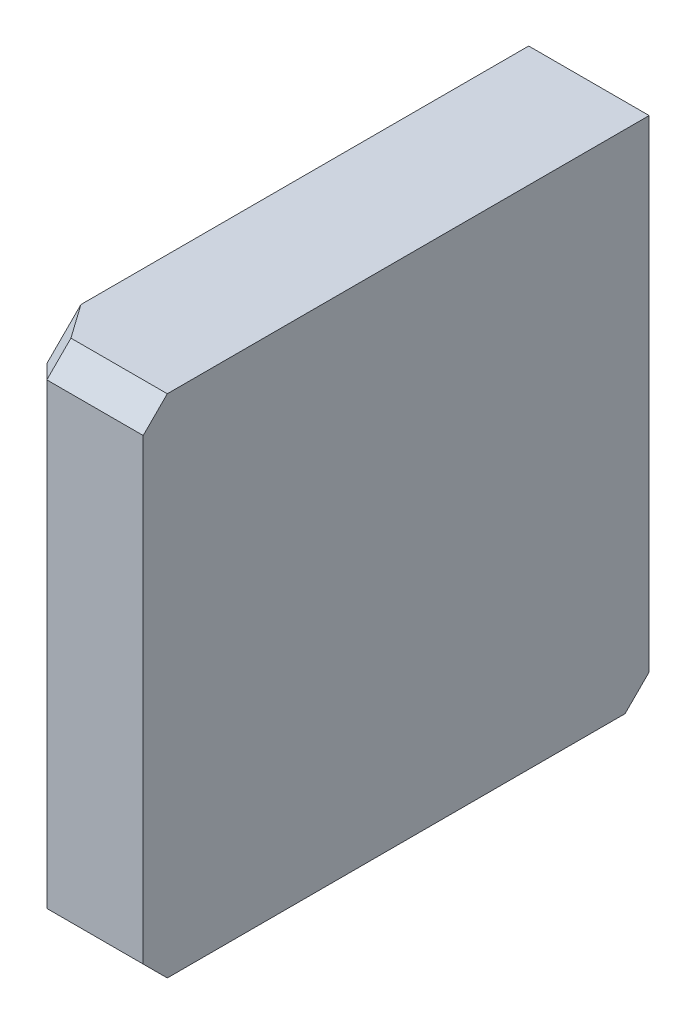
ISO-10303-21;
HEADER;
FILE_DESCRIPTION(('STEP AP214'),'2;1');
FILE_NAME('part.step','',(''),(''),'','','');
FILE_SCHEMA(('AUTOMOTIVE_DESIGN { 1 0 10303 214 1 1 1 1 }'));
ENDSEC;
DATA;
#1=APPLICATION_CONTEXT('core data for automotive mechanical design processes');
#2=APPLICATION_PROTOCOL_DEFINITION('international standard','automotive_design',2000,#1);
#3=PRODUCT_CONTEXT('',#1,'mechanical');
#4=PRODUCT('Part','Part','',(#3));
#5=PRODUCT_RELATED_PRODUCT_CATEGORY('part','',(#4));
#6=PRODUCT_DEFINITION_FORMATION('','',#4);
#7=PRODUCT_DEFINITION_CONTEXT('part definition',#1,'design');
#8=PRODUCT_DEFINITION('design','',#6,#7);
#9=PRODUCT_DEFINITION_SHAPE('','',#8);
#10=(LENGTH_UNIT() NAMED_UNIT(*) SI_UNIT(.MILLI.,.METRE.));
#11=(NAMED_UNIT(*) PLANE_ANGLE_UNIT() SI_UNIT($,.RADIAN.));
#12=(NAMED_UNIT(*) SI_UNIT($,.STERADIAN.) SOLID_ANGLE_UNIT());
#13=UNCERTAINTY_MEASURE_WITH_UNIT(LENGTH_MEASURE(1.E-05),#10,'distance_accuracy_value','');
#14=(GEOMETRIC_REPRESENTATION_CONTEXT(3) GLOBAL_UNCERTAINTY_ASSIGNED_CONTEXT((#13)) GLOBAL_UNIT_ASSIGNED_CONTEXT((#10,
#11,#12)) REPRESENTATION_CONTEXT('',''));
#15=CARTESIAN_POINT('',(0.,0.,0.));
#16=DIRECTION('',(0.,0.,1.));
#17=DIRECTION('',(1.,0.,0.));
#18=AXIS2_PLACEMENT_3D('',#15,#16,#17);
#19=CARTESIAN_POINT('',(-31.1,33.4607864376269,33.460786437627));
#20=DIRECTION('',(0.707106781186548,-0.499999999999999,-0.500000000000001));
#21=DIRECTION('',(-0.577350269189626,0.,-0.816496580927726));
#22=AXIS2_PLACEMENT_3D('',#19,#20,#21);
#23=PLANE('',#22);
#24=DIRECTION('',(0.,0.707106781186549,-0.707106781186546));
#25=VECTOR('',#24,1.);
#26=CARTESIAN_POINT('',(-29.1,21.,48.75));
#27=LINE('',#26,#25);
#28=CARTESIAN_POINT('',(-29.1,19.,50.75));
#29=VERTEX_POINT('',#28);
#30=CARTESIAN_POINT('',(-29.1,21.,48.75));
#31=VERTEX_POINT('',#30);
#32=EDGE_CURVE('E153',#29,#31,#27,.T.);
#33=ORIENTED_EDGE('',*,*,#32,.T.);
#34=DIRECTION('',(-0.577350269189624,0.,-0.816496580927727));
#35=VECTOR('',#34,1.);
#36=CARTESIAN_POINT('',(-29.1,21.,48.75));
#37=LINE('',#36,#35);
#38=CARTESIAN_POINT('',(-31.1,21.,45.9215728752538));
#39=VERTEX_POINT('',#38);
#40=EDGE_CURVE('E188',#31,#39,#37,.T.);
#41=ORIENTED_EDGE('',*,*,#40,.T.);
#42=DIRECTION('',(0.,-0.707106781186548,0.707106781186548));
#43=VECTOR('',#42,1.);
#44=CARTESIAN_POINT('',(-31.1,21.,45.9215728752538));
#45=LINE('',#44,#43);
#46=CARTESIAN_POINT('',(-31.1,18.1715728752538,48.75));
#47=VERTEX_POINT('',#46);
#48=EDGE_CURVE('E134',#39,#47,#45,.T.);
#49=ORIENTED_EDGE('',*,*,#48,.T.);
#50=DIRECTION('',(0.678598344545846,0.281084637714823,0.678598344545846));
#51=VECTOR('',#50,1.);
#52=CARTESIAN_POINT('',(-31.1,18.1715728752538,48.75));
#53=LINE('',#52,#51);
#54=EDGE_CURVE('E19',#47,#29,#53,.T.);
#55=ORIENTED_EDGE('',*,*,#54,.T.);
#56=EDGE_LOOP('',(#33,#41,#49,#55));
#57=FACE_BOUND('',#56,.T.);
#58=ADVANCED_FACE('F16',(#57),#23,.F.);
#59=CARTESIAN_POINT('',(-31.1,29.75,48.75));
#60=DIRECTION('',(0.707106781186548,0.,-0.707106781186548));
#61=DIRECTION('',(-0.707106781186548,0.,-0.707106781186548));
#62=AXIS2_PLACEMENT_3D('',#59,#60,#61);
#63=PLANE('',#62);
#64=DIRECTION('',(0.,1.,0.));
#65=VECTOR('',#64,1.);
#66=CARTESIAN_POINT('',(-29.1,-21.,50.75));
#67=LINE('',#66,#65);
#68=CARTESIAN_POINT('',(-29.1,-19.,50.75));
#69=VERTEX_POINT('',#68);
#70=EDGE_CURVE('E156',#69,#29,#67,.T.);
#71=ORIENTED_EDGE('',*,*,#70,.T.);
#72=ORIENTED_EDGE('',*,*,#54,.F.);
#73=DIRECTION('',(0.,1.,0.));
#74=VECTOR('',#73,1.);
#75=CARTESIAN_POINT('',(-31.1,29.75,48.75));
#76=LINE('',#75,#74);
#77=CARTESIAN_POINT('',(-31.1,-18.1715728752539,48.75));
#78=VERTEX_POINT('',#77);
#79=EDGE_CURVE('E140',#47,#78,#76,.F.);
#80=ORIENTED_EDGE('',*,*,#79,.T.);
#81=DIRECTION('',(0.678598344545846,-0.28108463771481,0.678598344545853));
#82=VECTOR('',#81,1.);
#83=CARTESIAN_POINT('',(-31.1,-18.1715728752538,48.75));
#84=LINE('',#83,#82);
#85=EDGE_CURVE('E106',#78,#69,#84,.T.);
#86=ORIENTED_EDGE('',*,*,#85,.T.);
#87=EDGE_LOOP('',(#71,#72,#80,#86));
#88=FACE_BOUND('',#87,.T.);
#89=ADVANCED_FACE('F157',(#88),#63,.F.);
#90=CARTESIAN_POINT('',(-31.1,-3.71078643762699,63.2107864376269));
#91=DIRECTION('',(0.707106781186547,0.500000000000002,-0.5));
#92=DIRECTION('',(-0.577350269189627,0.816496580927725,0.));
#93=AXIS2_PLACEMENT_3D('',#90,#91,#92);
#94=PLANE('',#93);
#95=DIRECTION('',(0.,0.707106781186546,0.707106781186549));
#96=VECTOR('',#95,1.);
#97=CARTESIAN_POINT('',(-29.1,-19.,50.75));
#98=LINE('',#97,#96);
#99=CARTESIAN_POINT('',(-29.1,-21.,48.75));
#100=VERTEX_POINT('',#99);
#101=EDGE_CURVE('E177',#100,#69,#98,.T.);
#102=ORIENTED_EDGE('',*,*,#101,.T.);
#103=ORIENTED_EDGE('',*,*,#85,.F.);
#104=DIRECTION('',(0.,-0.707106781186527,-0.707106781186568));
#105=VECTOR('',#104,1.);
#106=CARTESIAN_POINT('',(-31.1,-18.1715728752538,48.75));
#107=LINE('',#106,#105);
#108=CARTESIAN_POINT('',(-31.1,-19.,47.9215728752538));
#109=VERTEX_POINT('',#108);
#110=EDGE_CURVE('E109',#78,#109,#107,.T.);
#111=ORIENTED_EDGE('',*,*,#110,.T.);
#112=DIRECTION('',(0.678598344545846,-0.678598344545846,0.281084637714823));
#113=VECTOR('',#112,1.);
#114=CARTESIAN_POINT('',(-31.1,-19.,47.9215728752538));
#115=LINE('',#114,#113);
#116=EDGE_CURVE('E112',#109,#100,#115,.T.);
#117=ORIENTED_EDGE('',*,*,#116,.T.);
#118=EDGE_LOOP('',(#102,#103,#111,#117));
#119=FACE_BOUND('',#118,.T.);
#120=ADVANCED_FACE('F111',(#119),#94,.F.);
#121=CARTESIAN_POINT('',(-31.1,-19.,29.75));
#122=DIRECTION('',(0.707106781186548,0.707106781186548,0.));
#123=DIRECTION('',(-0.707106781186548,0.707106781186548,0.));
#124=AXIS2_PLACEMENT_3D('',#121,#122,#123);
#125=PLANE('',#124);
#126=DIRECTION('',(0.,0.,1.));
#127=VECTOR('',#126,1.);
#128=CARTESIAN_POINT('',(-29.1,-21.,50.75));
#129=LINE('',#128,#127);
#130=CARTESIAN_POINT('',(-29.1,-21.,10.75));
#131=VERTEX_POINT('',#130);
#132=EDGE_CURVE('E124',#131,#100,#129,.T.);
#133=ORIENTED_EDGE('',*,*,#132,.T.);
#134=ORIENTED_EDGE('',*,*,#116,.F.);
#135=DIRECTION('',(0.,0.,-1.));
#136=VECTOR('',#135,1.);
#137=CARTESIAN_POINT('',(-31.1,-19.,29.75));
#138=LINE('',#137,#136);
#139=CARTESIAN_POINT('',(-31.1,-19.,11.5784271247462));
#140=VERTEX_POINT('',#139);
#141=EDGE_CURVE('E118',#109,#140,#138,.T.);
#142=ORIENTED_EDGE('',*,*,#141,.T.);
#143=DIRECTION('',(0.678598344545848,-0.678598344545843,-0.281084637714827));
#144=VECTOR('',#143,1.);
#145=CARTESIAN_POINT('',(-31.1,-19.,11.5784271247462));
#146=LINE('',#145,#144);
#147=EDGE_CURVE('E190',#140,#131,#146,.T.);
#148=ORIENTED_EDGE('',*,*,#147,.T.);
#149=EDGE_LOOP('',(#133,#134,#142,#148));
#150=FACE_BOUND('',#149,.T.);
#151=ADVANCED_FACE('F121',(#150),#125,.F.);
#152=CARTESIAN_POINT('',(-31.1,29.75,29.75));
#153=DIRECTION('',(1.,0.,0.));
#154=DIRECTION('',(0.,0.,-1.));
#155=AXIS2_PLACEMENT_3D('',#152,#153,#154);
#156=PLANE('',#155);
#157=ORIENTED_EDGE('',*,*,#48,.F.);
#158=DIRECTION('',(0.,0.,-1.));
#159=VECTOR('',#158,1.);
#160=CARTESIAN_POINT('',(-31.1,21.,50.75));
#161=LINE('',#160,#159);
#162=CARTESIAN_POINT('',(-31.1,21.,8.75));
#163=VERTEX_POINT('',#162);
#164=EDGE_CURVE('E170',#39,#163,#161,.T.);
#165=ORIENTED_EDGE('',*,*,#164,.T.);
#166=DIRECTION('',(0.,1.,0.));
#167=VECTOR('',#166,1.);
#168=CARTESIAN_POINT('',(-31.1,-21.,8.75));
#169=LINE('',#168,#167);
#170=CARTESIAN_POINT('',(-31.1,-16.1715728752538,8.75));
#171=VERTEX_POINT('',#170);
#172=EDGE_CURVE('E205',#163,#171,#169,.F.);
#173=ORIENTED_EDGE('',*,*,#172,.T.);
#174=DIRECTION('',(0.,-0.70710678118655,0.707106781186544));
#175=VECTOR('',#174,1.);
#176=CARTESIAN_POINT('',(-31.1,-16.1715728752538,8.74999999999999));
#177=LINE('',#176,#175);
#178=EDGE_CURVE('E131',#171,#140,#177,.T.);
#179=ORIENTED_EDGE('',*,*,#178,.T.);
#180=ORIENTED_EDGE('',*,*,#141,.F.);
#181=ORIENTED_EDGE('',*,*,#110,.F.);
#182=ORIENTED_EDGE('',*,*,#79,.F.);
#183=EDGE_LOOP('',(#157,#165,#173,#179,#180,#181,#182));
#184=FACE_BOUND('',#183,.T.);
#185=ADVANCED_FACE('F129',(#184),#156,.F.);
#186=CARTESIAN_POINT('',(-31.1,-3.71078643762681,-3.71078643762692));
#187=DIRECTION('',(0.707106781186548,0.499999999999999,0.500000000000001));
#188=DIRECTION('',(0.577350269189626,0.,-0.816496580927726));
#189=AXIS2_PLACEMENT_3D('',#186,#187,#188);
#190=PLANE('',#189);
#191=DIRECTION('',(0.,-0.707106781186549,0.707106781186546));
#192=VECTOR('',#191,1.);
#193=CARTESIAN_POINT('',(-29.1,-21.,10.75));
#194=LINE('',#193,#192);
#195=CARTESIAN_POINT('',(-29.1,-19.,8.75));
#196=VERTEX_POINT('',#195);
#197=EDGE_CURVE('E220',#196,#131,#194,.T.);
#198=ORIENTED_EDGE('',*,*,#197,.T.);
#199=ORIENTED_EDGE('',*,*,#147,.F.);
#200=ORIENTED_EDGE('',*,*,#178,.F.);
#201=DIRECTION('',(0.577350269189618,-0.816496580927732,0.));
#202=VECTOR('',#201,1.);
#203=CARTESIAN_POINT('',(-31.1,-16.1715728752538,8.75));
#204=LINE('',#203,#202);
#205=EDGE_CURVE('E210',#171,#196,#204,.T.);
#206=ORIENTED_EDGE('',*,*,#205,.T.);
#207=EDGE_LOOP('',(#198,#199,#200,#206));
#208=FACE_BOUND('',#207,.T.);
#209=ADVANCED_FACE('F279',(#208),#190,.F.);
#210=CARTESIAN_POINT('',(-31.1,21.,50.75));
#211=DIRECTION('',(0.,-1.,0.));
#212=DIRECTION('',(0.,0.,-1.));
#213=AXIS2_PLACEMENT_3D('',#210,#211,#212);
#214=PLANE('',#213);
#215=ORIENTED_EDGE('',*,*,#40,.F.);
#216=DIRECTION('',(1.,0.,0.));
#217=VECTOR('',#216,1.);
#218=CARTESIAN_POINT('',(-31.1,21.,48.75));
#219=LINE('',#218,#217);
#220=CARTESIAN_POINT('',(-21.1,21.,48.75));
#221=VERTEX_POINT('',#220);
#222=EDGE_CURVE('E163',#31,#221,#219,.T.);
#223=ORIENTED_EDGE('',*,*,#222,.T.);
#224=DIRECTION('',(0.,0.,-1.));
#225=VECTOR('',#224,1.);
#226=CARTESIAN_POINT('',(-21.1,21.,29.75));
#227=LINE('',#226,#225);
#228=CARTESIAN_POINT('',(-21.1,21.,8.75));
#229=VERTEX_POINT('',#228);
#230=EDGE_CURVE('E202',#229,#221,#227,.F.);
#231=ORIENTED_EDGE('',*,*,#230,.F.);
#232=DIRECTION('',(1.,0.,0.));
#233=VECTOR('',#232,1.);
#234=CARTESIAN_POINT('',(-31.1,21.,8.75));
#235=LINE('',#234,#233);
#236=EDGE_CURVE('E199',#229,#163,#235,.F.);
#237=ORIENTED_EDGE('',*,*,#236,.T.);
#238=ORIENTED_EDGE('',*,*,#164,.F.);
#239=EDGE_LOOP('',(#215,#223,#231,#237,#238));
#240=FACE_BOUND('',#239,.T.);
#241=ADVANCED_FACE('F197',(#240),#214,.F.);
#242=CARTESIAN_POINT('',(-31.1,21.,48.75));
#243=DIRECTION('',(0.,-0.707106781186546,-0.707106781186549));
#244=DIRECTION('',(0.,0.707106781186549,-0.707106781186546));
#245=AXIS2_PLACEMENT_3D('',#242,#243,#244);
#246=PLANE('',#245);
#247=ORIENTED_EDGE('',*,*,#32,.F.);
#248=DIRECTION('',(-1.,0.,0.));
#249=VECTOR('',#248,1.);
#250=CARTESIAN_POINT('',(-31.1,19.,50.75));
#251=LINE('',#250,#249);
#252=CARTESIAN_POINT('',(-21.1,19.,50.75));
#253=VERTEX_POINT('',#252);
#254=EDGE_CURVE('E162',#29,#253,#251,.F.);
#255=ORIENTED_EDGE('',*,*,#254,.T.);
#256=DIRECTION('',(0.,-0.707106781186547,0.707106781186547));
#257=VECTOR('',#256,1.);
#258=CARTESIAN_POINT('',(-21.1,21.,48.75));
#259=LINE('',#258,#257);
#260=EDGE_CURVE('E241',#221,#253,#259,.T.);
#261=ORIENTED_EDGE('',*,*,#260,.F.);
#262=ORIENTED_EDGE('',*,*,#222,.F.);
#263=EDGE_LOOP('',(#247,#255,#261,#262));
#264=FACE_BOUND('',#263,.T.);
#265=ADVANCED_FACE('F167',(#264),#246,.F.);
#266=CARTESIAN_POINT('',(-31.1,-21.,50.75));
#267=DIRECTION('',(0.,0.,-1.));
#268=DIRECTION('',(-1.,0.,0.));
#269=AXIS2_PLACEMENT_3D('',#266,#267,#268);
#270=PLANE('',#269);
#271=ORIENTED_EDGE('',*,*,#70,.F.);
#272=DIRECTION('',(1.,0.,0.));
#273=VECTOR('',#272,1.);
#274=CARTESIAN_POINT('',(-31.1,-19.,50.75));
#275=LINE('',#274,#273);
#276=CARTESIAN_POINT('',(-21.1,-19.,50.75));
#277=VERTEX_POINT('',#276);
#278=EDGE_CURVE('E181',#69,#277,#275,.T.);
#279=ORIENTED_EDGE('',*,*,#278,.T.);
#280=DIRECTION('',(0.,1.,0.));
#281=VECTOR('',#280,1.);
#282=CARTESIAN_POINT('',(-21.1,29.75,50.75));
#283=LINE('',#282,#281);
#284=EDGE_CURVE('E174',#253,#277,#283,.F.);
#285=ORIENTED_EDGE('',*,*,#284,.F.);
#286=ORIENTED_EDGE('',*,*,#254,.F.);
#287=EDGE_LOOP('',(#271,#279,#285,#286));
#288=FACE_BOUND('',#287,.T.);
#289=ADVANCED_FACE('F172',(#288),#270,.F.);
#290=CARTESIAN_POINT('',(-31.1,-19.,50.75));
#291=DIRECTION('',(0.,0.707106781186549,-0.707106781186546));
#292=DIRECTION('',(0.,0.707106781186546,0.707106781186549));
#293=AXIS2_PLACEMENT_3D('',#290,#291,#292);
#294=PLANE('',#293);
#295=ORIENTED_EDGE('',*,*,#101,.F.);
#296=DIRECTION('',(1.,0.,0.));
#297=VECTOR('',#296,1.);
#298=CARTESIAN_POINT('',(-31.1,-21.,48.75));
#299=LINE('',#298,#297);
#300=CARTESIAN_POINT('',(-21.1,-21.,48.75));
#301=VERTEX_POINT('',#300);
#302=EDGE_CURVE('E224',#100,#301,#299,.T.);
#303=ORIENTED_EDGE('',*,*,#302,.T.);
#304=DIRECTION('',(0.,-0.707106781186547,-0.707106781186547));
#305=VECTOR('',#304,1.);
#306=CARTESIAN_POINT('',(-21.1,-19.,50.75));
#307=LINE('',#306,#305);
#308=EDGE_CURVE('E230',#277,#301,#307,.T.);
#309=ORIENTED_EDGE('',*,*,#308,.F.);
#310=ORIENTED_EDGE('',*,*,#278,.F.);
#311=EDGE_LOOP('',(#295,#303,#309,#310));
#312=FACE_BOUND('',#311,.T.);
#313=ADVANCED_FACE('F231',(#312),#294,.F.);
#314=CARTESIAN_POINT('',(-31.1,-21.,50.75));
#315=DIRECTION('',(0.,1.,0.));
#316=DIRECTION('',(0.,0.,1.));
#317=AXIS2_PLACEMENT_3D('',#314,#315,#316);
#318=PLANE('',#317);
#319=ORIENTED_EDGE('',*,*,#132,.F.);
#320=DIRECTION('',(1.,0.,0.));
#321=VECTOR('',#320,1.);
#322=CARTESIAN_POINT('',(-31.1,-21.,10.75));
#323=LINE('',#322,#321);
#324=CARTESIAN_POINT('',(-21.1,-21.,10.75));
#325=VERTEX_POINT('',#324);
#326=EDGE_CURVE('E206',#131,#325,#323,.T.);
#327=ORIENTED_EDGE('',*,*,#326,.T.);
#328=DIRECTION('',(0.,0.,-1.));
#329=VECTOR('',#328,1.);
#330=CARTESIAN_POINT('',(-21.1,-21.,29.75));
#331=LINE('',#330,#329);
#332=EDGE_CURVE('E237',#301,#325,#331,.T.);
#333=ORIENTED_EDGE('',*,*,#332,.F.);
#334=ORIENTED_EDGE('',*,*,#302,.F.);
#335=EDGE_LOOP('',(#319,#327,#333,#334));
#336=FACE_BOUND('',#335,.T.);
#337=ADVANCED_FACE('F253',(#336),#318,.F.);
#338=CARTESIAN_POINT('',(-31.1,-21.,10.75));
#339=DIRECTION('',(0.,0.707106781186546,0.707106781186549));
#340=DIRECTION('',(0.,-0.707106781186549,0.707106781186546));
#341=AXIS2_PLACEMENT_3D('',#338,#339,#340);
#342=PLANE('',#341);
#343=ORIENTED_EDGE('',*,*,#197,.F.);
#344=DIRECTION('',(1.,0.,0.));
#345=VECTOR('',#344,1.);
#346=CARTESIAN_POINT('',(-31.1,-19.,8.75));
#347=LINE('',#346,#345);
#348=CARTESIAN_POINT('',(-21.1,-19.,8.75));
#349=VERTEX_POINT('',#348);
#350=EDGE_CURVE('E35',#196,#349,#347,.T.);
#351=ORIENTED_EDGE('',*,*,#350,.T.);
#352=DIRECTION('',(0.,0.707106781186548,-0.707106781186547));
#353=VECTOR('',#352,1.);
#354=CARTESIAN_POINT('',(-21.1,-21.,10.75));
#355=LINE('',#354,#353);
#356=EDGE_CURVE('E26',#325,#349,#355,.T.);
#357=ORIENTED_EDGE('',*,*,#356,.F.);
#358=ORIENTED_EDGE('',*,*,#326,.F.);
#359=EDGE_LOOP('',(#343,#351,#357,#358));
#360=FACE_BOUND('',#359,.T.);
#361=ADVANCED_FACE('F255',(#360),#342,.F.);
#362=CARTESIAN_POINT('',(-31.1,-21.,8.75));
#363=DIRECTION('',(0.,0.,1.));
#364=DIRECTION('',(1.,0.,0.));
#365=AXIS2_PLACEMENT_3D('',#362,#363,#364);
#366=PLANE('',#365);
#367=ORIENTED_EDGE('',*,*,#205,.F.);
#368=ORIENTED_EDGE('',*,*,#172,.F.);
#369=ORIENTED_EDGE('',*,*,#236,.F.);
#370=DIRECTION('',(0.,1.,0.));
#371=VECTOR('',#370,1.);
#372=CARTESIAN_POINT('',(-21.1,29.75,8.75));
#373=LINE('',#372,#371);
#374=EDGE_CURVE('E11',#349,#229,#373,.T.);
#375=ORIENTED_EDGE('',*,*,#374,.F.);
#376=ORIENTED_EDGE('',*,*,#350,.F.);
#377=EDGE_LOOP('',(#367,#368,#369,#375,#376));
#378=FACE_BOUND('',#377,.T.);
#379=ADVANCED_FACE('F209',(#378),#366,.F.);
#380=CARTESIAN_POINT('',(-21.1,29.75,29.75));
#381=DIRECTION('',(1.,0.,0.));
#382=DIRECTION('',(0.,0.,-1.));
#383=AXIS2_PLACEMENT_3D('',#380,#381,#382);
#384=PLANE('',#383);
#385=ORIENTED_EDGE('',*,*,#356,.T.);
#386=ORIENTED_EDGE('',*,*,#374,.T.);
#387=ORIENTED_EDGE('',*,*,#230,.T.);
#388=ORIENTED_EDGE('',*,*,#260,.T.);
#389=ORIENTED_EDGE('',*,*,#284,.T.);
#390=ORIENTED_EDGE('',*,*,#308,.T.);
#391=ORIENTED_EDGE('',*,*,#332,.T.);
#392=EDGE_LOOP('',(#385,#386,#387,#388,#389,#390,#391));
#393=FACE_BOUND('',#392,.T.);
#394=ADVANCED_FACE('F240',(#393),#384,.T.);
#395=CLOSED_SHELL('',(#58,#89,#120,#151,#185,#209,#241,#265,#289,#313,#337,#361,#379,#394));
#396=MANIFOLD_SOLID_BREP('B1',#395);
#397=ADVANCED_BREP_SHAPE_REPRESENTATION('',(#18,#396),#14);
#398=SHAPE_DEFINITION_REPRESENTATION(#9,#397);
ENDSEC;
END-ISO-10303-21;
